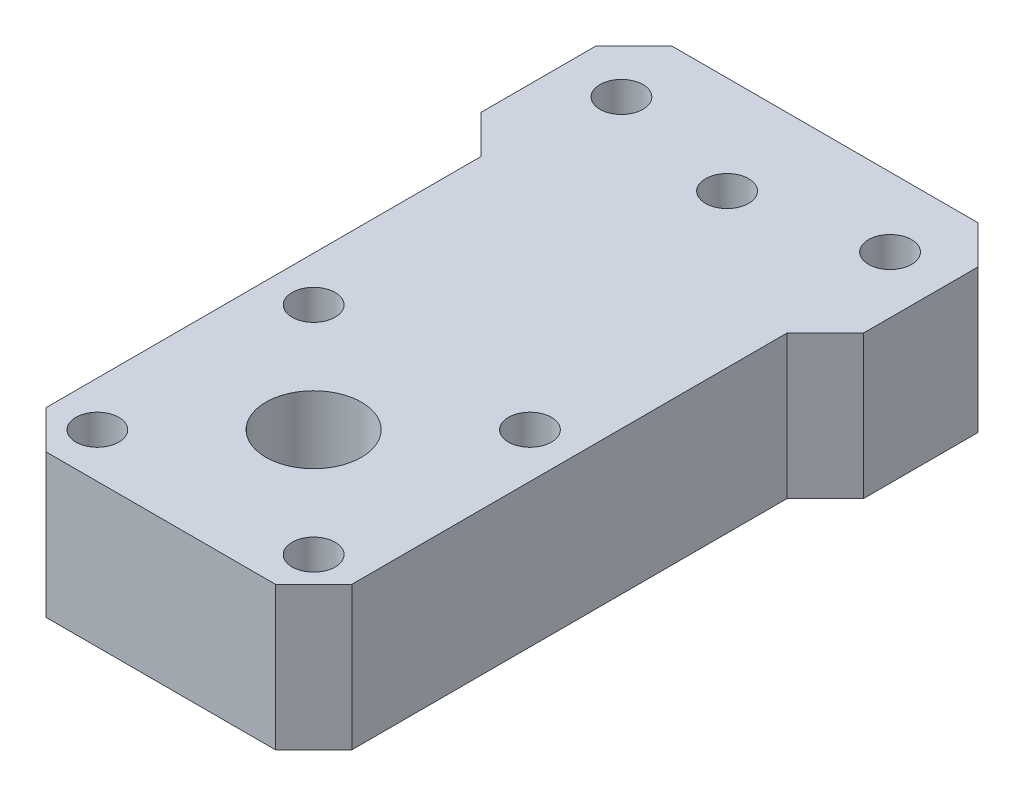
ISO-10303-21;
HEADER;
FILE_DESCRIPTION(('STEP AP214'),'2;1');
FILE_NAME('part.step','',(''),(''),'','','');
FILE_SCHEMA(('AUTOMOTIVE_DESIGN { 1 0 10303 214 1 1 1 1 }'));
ENDSEC;
DATA;
#1=APPLICATION_CONTEXT('core data for automotive mechanical design processes');
#2=APPLICATION_PROTOCOL_DEFINITION('international standard','automotive_design',2000,#1);
#3=PRODUCT_CONTEXT('',#1,'mechanical');
#4=PRODUCT('Part','Part','',(#3));
#5=PRODUCT_RELATED_PRODUCT_CATEGORY('part','',(#4));
#6=PRODUCT_DEFINITION_FORMATION('','',#4);
#7=PRODUCT_DEFINITION_CONTEXT('part definition',#1,'design');
#8=PRODUCT_DEFINITION('design','',#6,#7);
#9=PRODUCT_DEFINITION_SHAPE('','',#8);
#10=(LENGTH_UNIT() NAMED_UNIT(*) SI_UNIT(.MILLI.,.METRE.));
#11=(NAMED_UNIT(*) PLANE_ANGLE_UNIT() SI_UNIT($,.RADIAN.));
#12=(NAMED_UNIT(*) SI_UNIT($,.STERADIAN.) SOLID_ANGLE_UNIT());
#13=UNCERTAINTY_MEASURE_WITH_UNIT(LENGTH_MEASURE(1.E-05),#10,'distance_accuracy_value','');
#14=(GEOMETRIC_REPRESENTATION_CONTEXT(3) GLOBAL_UNCERTAINTY_ASSIGNED_CONTEXT((#13)) GLOBAL_UNIT_ASSIGNED_CONTEXT((#10,
#11,#12)) REPRESENTATION_CONTEXT('',''));
#15=CARTESIAN_POINT('',(0.,0.,0.));
#16=DIRECTION('',(0.,0.,1.));
#17=DIRECTION('',(1.,0.,0.));
#18=AXIS2_PLACEMENT_3D('',#15,#16,#17);
#19=CARTESIAN_POINT('',(-16.,15.,16.));
#20=DIRECTION('',(1.,0.,0.));
#21=DIRECTION('',(0.,0.,-1.));
#22=AXIS2_PLACEMENT_3D('',#19,#20,#21);
#23=PLANE('',#22);
#24=DIRECTION('',(0.,0.,1.));
#25=VECTOR('',#24,1.);
#26=CARTESIAN_POINT('',(-16.,15.,16.));
#27=LINE('',#26,#25);
#28=CARTESIAN_POINT('',(-16.,15.,-33.5));
#29=VERTEX_POINT('',#28);
#30=CARTESIAN_POINT('',(-16.,15.,12.));
#31=VERTEX_POINT('',#30);
#32=EDGE_CURVE('E186',#29,#31,#27,.T.);
#33=ORIENTED_EDGE('',*,*,#32,.F.);
#34=DIRECTION('',(0.,-1.,0.));
#35=VECTOR('',#34,1.);
#36=CARTESIAN_POINT('',(-16.,0.,-33.5));
#37=LINE('',#36,#35);
#38=CARTESIAN_POINT('',(-16.,0.,-33.5));
#39=VERTEX_POINT('',#38);
#40=EDGE_CURVE('E128',#29,#39,#37,.T.);
#41=ORIENTED_EDGE('',*,*,#40,.T.);
#42=DIRECTION('',(0.,0.,1.));
#43=VECTOR('',#42,1.);
#44=CARTESIAN_POINT('',(-16.,0.,16.));
#45=LINE('',#44,#43);
#46=CARTESIAN_POINT('',(-16.,0.,12.));
#47=VERTEX_POINT('',#46);
#48=EDGE_CURVE('E183',#39,#47,#45,.T.);
#49=ORIENTED_EDGE('',*,*,#48,.T.);
#50=DIRECTION('',(0.,1.,0.));
#51=VECTOR('',#50,1.);
#52=CARTESIAN_POINT('',(-16.,15.,12.));
#53=LINE('',#52,#51);
#54=EDGE_CURVE('E196',#47,#31,#53,.T.);
#55=ORIENTED_EDGE('',*,*,#54,.T.);
#56=EDGE_LOOP('',(#33,#41,#49,#55));
#57=FACE_BOUND('',#56,.T.);
#58=ADVANCED_FACE('F32',(#57),#23,.F.);
#59=CARTESIAN_POINT('',(16.,15.,16.));
#60=DIRECTION('',(-1.,0.,0.));
#61=DIRECTION('',(0.,0.,1.));
#62=AXIS2_PLACEMENT_3D('',#59,#60,#61);
#63=PLANE('',#62);
#64=DIRECTION('',(0.,0.,-1.));
#65=VECTOR('',#64,1.);
#66=CARTESIAN_POINT('',(16.,0.,16.));
#67=LINE('',#66,#65);
#68=CARTESIAN_POINT('',(16.,0.,12.));
#69=VERTEX_POINT('',#68);
#70=CARTESIAN_POINT('',(16.,0.,-33.5));
#71=VERTEX_POINT('',#70);
#72=EDGE_CURVE('E201',#69,#71,#67,.T.);
#73=ORIENTED_EDGE('',*,*,#72,.T.);
#74=DIRECTION('',(0.,1.,0.));
#75=VECTOR('',#74,1.);
#76=CARTESIAN_POINT('',(16.,15.,-33.5));
#77=LINE('',#76,#75);
#78=CARTESIAN_POINT('',(16.,15.,-33.5));
#79=VERTEX_POINT('',#78);
#80=EDGE_CURVE('E211',#71,#79,#77,.T.);
#81=ORIENTED_EDGE('',*,*,#80,.T.);
#82=DIRECTION('',(0.,0.,-1.));
#83=VECTOR('',#82,1.);
#84=CARTESIAN_POINT('',(16.,15.,16.));
#85=LINE('',#84,#83);
#86=CARTESIAN_POINT('',(16.,15.,12.));
#87=VERTEX_POINT('',#86);
#88=EDGE_CURVE('E191',#87,#79,#85,.T.);
#89=ORIENTED_EDGE('',*,*,#88,.F.);
#90=DIRECTION('',(0.,-1.,0.));
#91=VECTOR('',#90,1.);
#92=CARTESIAN_POINT('',(16.,15.,12.));
#93=LINE('',#92,#91);
#94=EDGE_CURVE('E208',#87,#69,#93,.T.);
#95=ORIENTED_EDGE('',*,*,#94,.T.);
#96=EDGE_LOOP('',(#73,#81,#89,#95));
#97=FACE_BOUND('',#96,.T.);
#98=ADVANCED_FACE('F252',(#97),#63,.F.);
#99=CARTESIAN_POINT('',(0.,15.,0.));
#100=DIRECTION('',(0.,-1.,0.));
#101=DIRECTION('',(0.,0.,-1.));
#102=AXIS2_PLACEMENT_3D('',#99,#100,#101);
#103=PLANE('',#102);
#104=CARTESIAN_POINT('',(-14.05,15.,-46.25));
#105=DIRECTION('',(0.,1.,0.));
#106=DIRECTION('',(0.,0.,1.));
#107=AXIS2_PLACEMENT_3D('',#104,#105,#106);
#108=CIRCLE('',#107,2.25);
#109=CARTESIAN_POINT('',(-14.05,15.,-44.));
#110=VERTEX_POINT('',#109);
#111=EDGE_CURVE('E277',#110,#110,#108,.T.);
#112=ORIENTED_EDGE('',*,*,#111,.F.);
#113=EDGE_LOOP('',(#112));
#114=FACE_BOUND('',#113,.T.);
#115=CARTESIAN_POINT('',(14.05,15.,-46.25));
#116=DIRECTION('',(0.,1.,0.));
#117=DIRECTION('',(0.,0.,1.));
#118=AXIS2_PLACEMENT_3D('',#115,#116,#117);
#119=CIRCLE('',#118,2.25);
#120=CARTESIAN_POINT('',(14.05,15.,-44.));
#121=VERTEX_POINT('',#120);
#122=EDGE_CURVE('E272',#121,#121,#119,.T.);
#123=ORIENTED_EDGE('',*,*,#122,.F.);
#124=EDGE_LOOP('',(#123));
#125=FACE_BOUND('',#124,.T.);
#126=CARTESIAN_POINT('',(0.,15.,-43.25));
#127=DIRECTION('',(0.,1.,0.));
#128=DIRECTION('',(0.,0.,1.));
#129=AXIS2_PLACEMENT_3D('',#126,#127,#128);
#130=CIRCLE('',#129,2.25);
#131=CARTESIAN_POINT('',(0.,15.,-41.));
#132=VERTEX_POINT('',#131);
#133=EDGE_CURVE('E267',#132,#132,#130,.T.);
#134=ORIENTED_EDGE('',*,*,#133,.F.);
#135=EDGE_LOOP('',(#134));
#136=FACE_BOUND('',#135,.T.);
#137=DIRECTION('',(0.,0.,-1.));
#138=VECTOR('',#137,1.);
#139=CARTESIAN_POINT('',(20.,15.,-53.5));
#140=LINE('',#139,#138);
#141=CARTESIAN_POINT('',(20.,15.,-37.5));
#142=VERTEX_POINT('',#141);
#143=CARTESIAN_POINT('',(20.,15.,-49.5));
#144=VERTEX_POINT('',#143);
#145=EDGE_CURVE('E144',#142,#144,#140,.T.);
#146=ORIENTED_EDGE('',*,*,#145,.T.);
#147=DIRECTION('',(0.707106781186546,0.,0.707106781186549));
#148=VECTOR('',#147,1.);
#149=CARTESIAN_POINT('',(16.,15.,-53.5));
#150=LINE('',#149,#148);
#151=CARTESIAN_POINT('',(16.,15.,-53.5));
#152=VERTEX_POINT('',#151);
#153=EDGE_CURVE('E232',#144,#152,#150,.F.);
#154=ORIENTED_EDGE('',*,*,#153,.T.);
#155=DIRECTION('',(-1.,0.,0.));
#156=VECTOR('',#155,1.);
#157=CARTESIAN_POINT('',(-16.,15.,-53.5));
#158=LINE('',#157,#156);
#159=CARTESIAN_POINT('',(-16.,15.,-53.5));
#160=VERTEX_POINT('',#159);
#161=EDGE_CURVE('E194',#152,#160,#158,.T.);
#162=ORIENTED_EDGE('',*,*,#161,.T.);
#163=DIRECTION('',(0.707106781186549,0.,-0.707106781186546));
#164=VECTOR('',#163,1.);
#165=CARTESIAN_POINT('',(-20.,15.,-49.5));
#166=LINE('',#165,#164);
#167=CARTESIAN_POINT('',(-20.,15.,-49.5));
#168=VERTEX_POINT('',#167);
#169=EDGE_CURVE('E139',#160,#168,#166,.F.);
#170=ORIENTED_EDGE('',*,*,#169,.T.);
#171=DIRECTION('',(0.,0.,1.));
#172=VECTOR('',#171,1.);
#173=CARTESIAN_POINT('',(-20.,15.,-53.5));
#174=LINE('',#173,#172);
#175=CARTESIAN_POINT('',(-20.,15.,-37.5));
#176=VERTEX_POINT('',#175);
#177=EDGE_CURVE('E133',#168,#176,#174,.T.);
#178=ORIENTED_EDGE('',*,*,#177,.T.);
#179=DIRECTION('',(-0.707106781186551,0.,-0.707106781186544));
#180=VECTOR('',#179,1.);
#181=CARTESIAN_POINT('',(8.75000000000009,15.,-8.75000000000018));
#182=LINE('',#181,#180);
#183=EDGE_CURVE('E122',#176,#29,#182,.F.);
#184=ORIENTED_EDGE('',*,*,#183,.T.);
#185=ORIENTED_EDGE('',*,*,#32,.T.);
#186=DIRECTION('',(-0.707106781186547,0.,-0.707106781186548));
#187=VECTOR('',#186,1.);
#188=CARTESIAN_POINT('',(-12.,15.,16.));
#189=LINE('',#188,#187);
#190=CARTESIAN_POINT('',(-12.,15.,16.));
#191=VERTEX_POINT('',#190);
#192=EDGE_CURVE('E54',#31,#191,#189,.F.);
#193=ORIENTED_EDGE('',*,*,#192,.T.);
#194=DIRECTION('',(1.,0.,0.));
#195=VECTOR('',#194,1.);
#196=CARTESIAN_POINT('',(-16.,15.,16.));
#197=LINE('',#196,#195);
#198=CARTESIAN_POINT('',(12.,15.,16.));
#199=VERTEX_POINT('',#198);
#200=EDGE_CURVE('E188',#191,#199,#197,.T.);
#201=ORIENTED_EDGE('',*,*,#200,.T.);
#202=DIRECTION('',(-0.707106781186549,0.,0.707106781186546));
#203=VECTOR('',#202,1.);
#204=CARTESIAN_POINT('',(16.,15.,12.));
#205=LINE('',#204,#203);
#206=EDGE_CURVE('E229',#199,#87,#205,.F.);
#207=ORIENTED_EDGE('',*,*,#206,.T.);
#208=ORIENTED_EDGE('',*,*,#88,.T.);
#209=DIRECTION('',(-0.707106781186551,0.,0.707106781186544));
#210=VECTOR('',#209,1.);
#211=CARTESIAN_POINT('',(-8.7500000000001,15.,-8.75000000000019));
#212=LINE('',#211,#210);
#213=EDGE_CURVE('E11',#79,#142,#212,.F.);
#214=ORIENTED_EDGE('',*,*,#213,.T.);
#215=EDGE_LOOP('',(#146,#154,#162,#170,#178,#184,#185,#193,#201,#207,#208,#214));
#216=FACE_BOUND('',#215,.T.);
#217=CARTESIAN_POINT('',(-11.3137084989848,15.,11.3137084989848));
#218=DIRECTION('',(0.,1.,0.));
#219=DIRECTION('',(0.,0.,1.));
#220=AXIS2_PLACEMENT_3D('',#217,#218,#219);
#221=CIRCLE('',#220,2.25);
#222=CARTESIAN_POINT('',(-11.3137084989848,15.,13.5637084989848));
#223=VERTEX_POINT('',#222);
#224=EDGE_CURVE('E153',#223,#223,#221,.T.);
#225=ORIENTED_EDGE('',*,*,#224,.F.);
#226=EDGE_LOOP('',(#225));
#227=FACE_BOUND('',#226,.T.);
#228=CARTESIAN_POINT('',(-11.3137084989848,15.,-11.3137084989848));
#229=DIRECTION('',(0.,1.,0.));
#230=DIRECTION('',(0.,0.,1.));
#231=AXIS2_PLACEMENT_3D('',#228,#229,#230);
#232=CIRCLE('',#231,2.25);
#233=CARTESIAN_POINT('',(-11.3137084989848,15.,-9.06370849898475));
#234=VERTEX_POINT('',#233);
#235=EDGE_CURVE('E162',#234,#234,#232,.T.);
#236=ORIENTED_EDGE('',*,*,#235,.F.);
#237=EDGE_LOOP('',(#236));
#238=FACE_BOUND('',#237,.T.);
#239=CARTESIAN_POINT('',(11.3137084989848,15.,-11.3137084989848));
#240=DIRECTION('',(0.,1.,0.));
#241=DIRECTION('',(0.,0.,1.));
#242=AXIS2_PLACEMENT_3D('',#239,#240,#241);
#243=CIRCLE('',#242,2.25);
#244=CARTESIAN_POINT('',(11.3137084989848,15.,-9.06370849898476));
#245=VERTEX_POINT('',#244);
#246=EDGE_CURVE('E168',#245,#245,#243,.T.);
#247=ORIENTED_EDGE('',*,*,#246,.F.);
#248=EDGE_LOOP('',(#247));
#249=FACE_BOUND('',#248,.T.);
#250=CARTESIAN_POINT('',(11.3137084989848,15.,11.3137084989848));
#251=DIRECTION('',(0.,1.,0.));
#252=DIRECTION('',(0.,0.,1.));
#253=AXIS2_PLACEMENT_3D('',#250,#251,#252);
#254=CIRCLE('',#253,2.25);
#255=CARTESIAN_POINT('',(11.3137084989848,15.,13.5637084989848));
#256=VERTEX_POINT('',#255);
#257=EDGE_CURVE('E174',#256,#256,#254,.T.);
#258=ORIENTED_EDGE('',*,*,#257,.F.);
#259=EDGE_LOOP('',(#258));
#260=FACE_BOUND('',#259,.T.);
#261=CARTESIAN_POINT('',(0.,15.,0.));
#262=DIRECTION('',(0.,1.,0.));
#263=DIRECTION('',(0.,0.,1.));
#264=AXIS2_PLACEMENT_3D('',#261,#262,#263);
#265=CIRCLE('',#264,5.);
#266=CARTESIAN_POINT('',(0.,15.,5.));
#267=VERTEX_POINT('',#266);
#268=EDGE_CURVE('E180',#267,#267,#265,.T.);
#269=ORIENTED_EDGE('',*,*,#268,.F.);
#270=EDGE_LOOP('',(#269));
#271=FACE_BOUND('',#270,.T.);
#272=ADVANCED_FACE('F135',(#114,#125,#136,#216,#227,#238,#249,#260,#271),#103,.F.);
#273=CARTESIAN_POINT('',(0.,0.,0.));
#274=DIRECTION('',(0.,-1.,0.));
#275=DIRECTION('',(0.,0.,-1.));
#276=AXIS2_PLACEMENT_3D('',#273,#274,#275);
#277=PLANE('',#276);
#278=CARTESIAN_POINT('',(-14.05,0.,-46.25));
#279=DIRECTION('',(0.,1.,0.));
#280=DIRECTION('',(0.,0.,1.));
#281=AXIS2_PLACEMENT_3D('',#278,#279,#280);
#282=CIRCLE('',#281,2.25);
#283=CARTESIAN_POINT('',(-14.05,0.,-44.));
#284=VERTEX_POINT('',#283);
#285=EDGE_CURVE('E280',#284,#284,#282,.T.);
#286=ORIENTED_EDGE('',*,*,#285,.T.);
#287=EDGE_LOOP('',(#286));
#288=FACE_BOUND('',#287,.T.);
#289=CARTESIAN_POINT('',(14.05,0.,-46.25));
#290=DIRECTION('',(0.,1.,0.));
#291=DIRECTION('',(0.,0.,1.));
#292=AXIS2_PLACEMENT_3D('',#289,#290,#291);
#293=CIRCLE('',#292,2.25);
#294=CARTESIAN_POINT('',(14.05,0.,-44.));
#295=VERTEX_POINT('',#294);
#296=EDGE_CURVE('E274',#295,#295,#293,.T.);
#297=ORIENTED_EDGE('',*,*,#296,.T.);
#298=EDGE_LOOP('',(#297));
#299=FACE_BOUND('',#298,.T.);
#300=CARTESIAN_POINT('',(0.,0.,-43.25));
#301=DIRECTION('',(0.,1.,0.));
#302=DIRECTION('',(0.,0.,1.));
#303=AXIS2_PLACEMENT_3D('',#300,#301,#302);
#304=CIRCLE('',#303,2.25);
#305=CARTESIAN_POINT('',(0.,0.,-41.));
#306=VERTEX_POINT('',#305);
#307=EDGE_CURVE('E264',#306,#306,#304,.T.);
#308=ORIENTED_EDGE('',*,*,#307,.T.);
#309=EDGE_LOOP('',(#308));
#310=FACE_BOUND('',#309,.T.);
#311=DIRECTION('',(-1.,0.,0.));
#312=VECTOR('',#311,1.);
#313=CARTESIAN_POINT('',(-16.,0.,-53.5));
#314=LINE('',#313,#312);
#315=CARTESIAN_POINT('',(16.,0.,-53.5));
#316=VERTEX_POINT('',#315);
#317=CARTESIAN_POINT('',(-16.,0.,-53.5));
#318=VERTEX_POINT('',#317);
#319=EDGE_CURVE('E189',#316,#318,#314,.T.);
#320=ORIENTED_EDGE('',*,*,#319,.F.);
#321=DIRECTION('',(-0.707106781186546,0.,-0.707106781186549));
#322=VECTOR('',#321,1.);
#323=CARTESIAN_POINT('',(34.75,0.,-34.7499999999999));
#324=LINE('',#323,#322);
#325=CARTESIAN_POINT('',(20.,0.,-49.5));
#326=VERTEX_POINT('',#325);
#327=EDGE_CURVE('E224',#316,#326,#324,.F.);
#328=ORIENTED_EDGE('',*,*,#327,.T.);
#329=DIRECTION('',(0.,0.,-1.));
#330=VECTOR('',#329,1.);
#331=CARTESIAN_POINT('',(20.,0.,-53.5));
#332=LINE('',#331,#330);
#333=CARTESIAN_POINT('',(20.,0.,-37.5));
#334=VERTEX_POINT('',#333);
#335=EDGE_CURVE('E247',#334,#326,#332,.T.);
#336=ORIENTED_EDGE('',*,*,#335,.F.);
#337=DIRECTION('',(0.707106781186551,0.,-0.707106781186544));
#338=VECTOR('',#337,1.);
#339=CARTESIAN_POINT('',(20.,0.,-37.5));
#340=LINE('',#339,#338);
#341=EDGE_CURVE('E40',#334,#71,#340,.F.);
#342=ORIENTED_EDGE('',*,*,#341,.T.);
#343=ORIENTED_EDGE('',*,*,#72,.F.);
#344=DIRECTION('',(0.707106781186549,0.,-0.707106781186546));
#345=VECTOR('',#344,1.);
#346=CARTESIAN_POINT('',(14.,0.,14.));
#347=LINE('',#346,#345);
#348=CARTESIAN_POINT('',(12.,0.,16.));
#349=VERTEX_POINT('',#348);
#350=EDGE_CURVE('E220',#69,#349,#347,.F.);
#351=ORIENTED_EDGE('',*,*,#350,.T.);
#352=DIRECTION('',(1.,0.,0.));
#353=VECTOR('',#352,1.);
#354=CARTESIAN_POINT('',(-16.,0.,16.));
#355=LINE('',#354,#353);
#356=CARTESIAN_POINT('',(-12.,0.,16.));
#357=VERTEX_POINT('',#356);
#358=EDGE_CURVE('E199',#357,#349,#355,.T.);
#359=ORIENTED_EDGE('',*,*,#358,.F.);
#360=DIRECTION('',(0.707106781186547,0.,0.707106781186548));
#361=VECTOR('',#360,1.);
#362=CARTESIAN_POINT('',(-14.,0.,14.));
#363=LINE('',#362,#361);
#364=EDGE_CURVE('E218',#357,#47,#363,.F.);
#365=ORIENTED_EDGE('',*,*,#364,.T.);
#366=ORIENTED_EDGE('',*,*,#48,.F.);
#367=DIRECTION('',(0.707106781186551,0.,0.707106781186544));
#368=VECTOR('',#367,1.);
#369=CARTESIAN_POINT('',(-20.,0.,-37.5));
#370=LINE('',#369,#368);
#371=CARTESIAN_POINT('',(-20.,0.,-37.5));
#372=VERTEX_POINT('',#371);
#373=EDGE_CURVE('E130',#39,#372,#370,.F.);
#374=ORIENTED_EDGE('',*,*,#373,.T.);
#375=DIRECTION('',(0.,0.,1.));
#376=VECTOR('',#375,1.);
#377=CARTESIAN_POINT('',(-20.,0.,-53.5));
#378=LINE('',#377,#376);
#379=CARTESIAN_POINT('',(-20.,0.,-49.5));
#380=VERTEX_POINT('',#379);
#381=EDGE_CURVE('E149',#380,#372,#378,.T.);
#382=ORIENTED_EDGE('',*,*,#381,.F.);
#383=DIRECTION('',(-0.707106781186549,0.,0.707106781186546));
#384=VECTOR('',#383,1.);
#385=CARTESIAN_POINT('',(-34.75,0.,-34.7500000000001));
#386=LINE('',#385,#384);
#387=EDGE_CURVE('E222',#380,#318,#386,.F.);
#388=ORIENTED_EDGE('',*,*,#387,.T.);
#389=EDGE_LOOP('',(#320,#328,#336,#342,#343,#351,#359,#365,#366,#374,#382,#388));
#390=FACE_BOUND('',#389,.T.);
#391=CARTESIAN_POINT('',(-11.3137084989848,0.,-11.3137084989848));
#392=DIRECTION('',(0.,1.,0.));
#393=DIRECTION('',(0.,0.,1.));
#394=AXIS2_PLACEMENT_3D('',#391,#392,#393);
#395=CIRCLE('',#394,2.25);
#396=CARTESIAN_POINT('',(-11.3137084989848,0.,-9.06370849898475));
#397=VERTEX_POINT('',#396);
#398=EDGE_CURVE('E160',#397,#397,#395,.T.);
#399=ORIENTED_EDGE('',*,*,#398,.T.);
#400=EDGE_LOOP('',(#399));
#401=FACE_BOUND('',#400,.T.);
#402=CARTESIAN_POINT('',(11.3137084989848,0.,11.3137084989848));
#403=DIRECTION('',(0.,1.,0.));
#404=DIRECTION('',(0.,0.,1.));
#405=AXIS2_PLACEMENT_3D('',#402,#403,#404);
#406=CIRCLE('',#405,2.25);
#407=CARTESIAN_POINT('',(11.3137084989848,0.,13.5637084989848));
#408=VERTEX_POINT('',#407);
#409=EDGE_CURVE('E171',#408,#408,#406,.T.);
#410=ORIENTED_EDGE('',*,*,#409,.T.);
#411=EDGE_LOOP('',(#410));
#412=FACE_BOUND('',#411,.T.);
#413=CARTESIAN_POINT('',(0.,0.,0.));
#414=DIRECTION('',(0.,1.,0.));
#415=DIRECTION('',(0.,0.,1.));
#416=AXIS2_PLACEMENT_3D('',#413,#414,#415);
#417=CIRCLE('',#416,5.);
#418=CARTESIAN_POINT('',(0.,0.,5.));
#419=VERTEX_POINT('',#418);
#420=EDGE_CURVE('E177',#419,#419,#417,.T.);
#421=ORIENTED_EDGE('',*,*,#420,.T.);
#422=EDGE_LOOP('',(#421));
#423=FACE_BOUND('',#422,.T.);
#424=CARTESIAN_POINT('',(11.3137084989848,0.,-11.3137084989848));
#425=DIRECTION('',(0.,1.,0.));
#426=DIRECTION('',(0.,0.,1.));
#427=AXIS2_PLACEMENT_3D('',#424,#425,#426);
#428=CIRCLE('',#427,2.25);
#429=CARTESIAN_POINT('',(11.3137084989848,0.,-9.06370849898476));
#430=VERTEX_POINT('',#429);
#431=EDGE_CURVE('E165',#430,#430,#428,.T.);
#432=ORIENTED_EDGE('',*,*,#431,.T.);
#433=EDGE_LOOP('',(#432));
#434=FACE_BOUND('',#433,.T.);
#435=CARTESIAN_POINT('',(-11.3137084989848,0.,11.3137084989848));
#436=DIRECTION('',(0.,1.,0.));
#437=DIRECTION('',(0.,0.,1.));
#438=AXIS2_PLACEMENT_3D('',#435,#436,#437);
#439=CIRCLE('',#438,2.25);
#440=CARTESIAN_POINT('',(-11.3137084989848,0.,13.5637084989848));
#441=VERTEX_POINT('',#440);
#442=EDGE_CURVE('E150',#441,#441,#439,.T.);
#443=ORIENTED_EDGE('',*,*,#442,.T.);
#444=EDGE_LOOP('',(#443));
#445=FACE_BOUND('',#444,.T.);
#446=ADVANCED_FACE('F244',(#288,#299,#310,#390,#401,#412,#423,#434,#445),#277,.T.);
#447=CARTESIAN_POINT('',(-16.,15.,16.));
#448=DIRECTION('',(0.,0.,-1.));
#449=DIRECTION('',(-1.,0.,0.));
#450=AXIS2_PLACEMENT_3D('',#447,#448,#449);
#451=PLANE('',#450);
#452=ORIENTED_EDGE('',*,*,#358,.T.);
#453=DIRECTION('',(0.,1.,0.));
#454=VECTOR('',#453,1.);
#455=CARTESIAN_POINT('',(12.,15.,16.));
#456=LINE('',#455,#454);
#457=EDGE_CURVE('E47',#349,#199,#456,.T.);
#458=ORIENTED_EDGE('',*,*,#457,.T.);
#459=ORIENTED_EDGE('',*,*,#200,.F.);
#460=DIRECTION('',(0.,-1.,0.));
#461=VECTOR('',#460,1.);
#462=CARTESIAN_POINT('',(-12.,15.,16.));
#463=LINE('',#462,#461);
#464=EDGE_CURVE('E236',#191,#357,#463,.T.);
#465=ORIENTED_EDGE('',*,*,#464,.T.);
#466=EDGE_LOOP('',(#452,#458,#459,#465));
#467=FACE_BOUND('',#466,.T.);
#468=ADVANCED_FACE('F304',(#467),#451,.F.);
#469=CARTESIAN_POINT('',(-16.,15.,-53.5));
#470=DIRECTION('',(0.,0.,1.));
#471=DIRECTION('',(1.,0.,0.));
#472=AXIS2_PLACEMENT_3D('',#469,#470,#471);
#473=PLANE('',#472);
#474=ORIENTED_EDGE('',*,*,#161,.F.);
#475=DIRECTION('',(0.,-1.,0.));
#476=VECTOR('',#475,1.);
#477=CARTESIAN_POINT('',(16.,15.,-53.5));
#478=LINE('',#477,#476);
#479=EDGE_CURVE('E215',#152,#316,#478,.T.);
#480=ORIENTED_EDGE('',*,*,#479,.T.);
#481=ORIENTED_EDGE('',*,*,#319,.T.);
#482=DIRECTION('',(0.,1.,0.));
#483=VECTOR('',#482,1.);
#484=CARTESIAN_POINT('',(-16.,15.,-53.5));
#485=LINE('',#484,#483);
#486=EDGE_CURVE('E213',#318,#160,#485,.T.);
#487=ORIENTED_EDGE('',*,*,#486,.T.);
#488=EDGE_LOOP('',(#474,#480,#481,#487));
#489=FACE_BOUND('',#488,.T.);
#490=ADVANCED_FACE('F350',(#489),#473,.F.);
#491=CARTESIAN_POINT('',(0.,15.,0.));
#492=DIRECTION('',(0.,-1.,0.));
#493=DIRECTION('',(0.,0.,-1.));
#494=AXIS2_PLACEMENT_3D('',#491,#492,#493);
#495=CYLINDRICAL_SURFACE('',#494,5.);
#496=ORIENTED_EDGE('',*,*,#268,.T.);
#497=EDGE_LOOP('',(#496));
#498=FACE_BOUND('',#497,.T.);
#499=ORIENTED_EDGE('',*,*,#420,.F.);
#500=EDGE_LOOP('',(#499));
#501=FACE_BOUND('',#500,.T.);
#502=ADVANCED_FACE('F353',(#498,#501),#495,.F.);
#503=CARTESIAN_POINT('',(11.3137084989848,15.,11.3137084989848));
#504=DIRECTION('',(0.,-1.,0.));
#505=DIRECTION('',(0.,0.,-1.));
#506=AXIS2_PLACEMENT_3D('',#503,#504,#505);
#507=CYLINDRICAL_SURFACE('',#506,2.25);
#508=ORIENTED_EDGE('',*,*,#257,.T.);
#509=EDGE_LOOP('',(#508));
#510=FACE_BOUND('',#509,.T.);
#511=ORIENTED_EDGE('',*,*,#409,.F.);
#512=EDGE_LOOP('',(#511));
#513=FACE_BOUND('',#512,.T.);
#514=ADVANCED_FACE('F359',(#510,#513),#507,.F.);
#515=CARTESIAN_POINT('',(11.3137084989848,15.,-11.3137084989848));
#516=DIRECTION('',(0.,-1.,0.));
#517=DIRECTION('',(0.,0.,-1.));
#518=AXIS2_PLACEMENT_3D('',#515,#516,#517);
#519=CYLINDRICAL_SURFACE('',#518,2.25);
#520=ORIENTED_EDGE('',*,*,#246,.T.);
#521=EDGE_LOOP('',(#520));
#522=FACE_BOUND('',#521,.T.);
#523=ORIENTED_EDGE('',*,*,#431,.F.);
#524=EDGE_LOOP('',(#523));
#525=FACE_BOUND('',#524,.T.);
#526=ADVANCED_FACE('F365',(#522,#525),#519,.F.);
#527=CARTESIAN_POINT('',(-11.3137084989848,15.,-11.3137084989848));
#528=DIRECTION('',(0.,-1.,0.));
#529=DIRECTION('',(0.,0.,-1.));
#530=AXIS2_PLACEMENT_3D('',#527,#528,#529);
#531=CYLINDRICAL_SURFACE('',#530,2.25);
#532=ORIENTED_EDGE('',*,*,#235,.T.);
#533=EDGE_LOOP('',(#532));
#534=FACE_BOUND('',#533,.T.);
#535=ORIENTED_EDGE('',*,*,#398,.F.);
#536=EDGE_LOOP('',(#535));
#537=FACE_BOUND('',#536,.T.);
#538=ADVANCED_FACE('F369',(#534,#537),#531,.F.);
#539=CARTESIAN_POINT('',(-11.3137084989848,15.,11.3137084989848));
#540=DIRECTION('',(0.,-1.,0.));
#541=DIRECTION('',(0.,0.,-1.));
#542=AXIS2_PLACEMENT_3D('',#539,#540,#541);
#543=CYLINDRICAL_SURFACE('',#542,2.25);
#544=ORIENTED_EDGE('',*,*,#224,.T.);
#545=EDGE_LOOP('',(#544));
#546=FACE_BOUND('',#545,.T.);
#547=ORIENTED_EDGE('',*,*,#442,.F.);
#548=EDGE_LOOP('',(#547));
#549=FACE_BOUND('',#548,.T.);
#550=ADVANCED_FACE('F373',(#546,#549),#543,.F.);
#551=CARTESIAN_POINT('',(20.,15.,-53.5));
#552=DIRECTION('',(-1.,0.,0.));
#553=DIRECTION('',(0.,0.,1.));
#554=AXIS2_PLACEMENT_3D('',#551,#552,#553);
#555=PLANE('',#554);
#556=ORIENTED_EDGE('',*,*,#335,.T.);
#557=DIRECTION('',(0.,1.,0.));
#558=VECTOR('',#557,1.);
#559=CARTESIAN_POINT('',(20.,15.,-49.5));
#560=LINE('',#559,#558);
#561=EDGE_CURVE('E226',#326,#144,#560,.T.);
#562=ORIENTED_EDGE('',*,*,#561,.T.);
#563=ORIENTED_EDGE('',*,*,#145,.F.);
#564=DIRECTION('',(0.,-1.,0.));
#565=VECTOR('',#564,1.);
#566=CARTESIAN_POINT('',(20.,15.,-37.5));
#567=LINE('',#566,#565);
#568=EDGE_CURVE('E143',#142,#334,#567,.T.);
#569=ORIENTED_EDGE('',*,*,#568,.T.);
#570=EDGE_LOOP('',(#556,#562,#563,#569));
#571=FACE_BOUND('',#570,.T.);
#572=ADVANCED_FACE('F260',(#571),#555,.F.);
#573=CARTESIAN_POINT('',(-20.,15.,-53.5));
#574=DIRECTION('',(1.,0.,0.));
#575=DIRECTION('',(0.,0.,-1.));
#576=AXIS2_PLACEMENT_3D('',#573,#574,#575);
#577=PLANE('',#576);
#578=ORIENTED_EDGE('',*,*,#177,.F.);
#579=DIRECTION('',(0.,-1.,0.));
#580=VECTOR('',#579,1.);
#581=CARTESIAN_POINT('',(-20.,15.,-49.5));
#582=LINE('',#581,#580);
#583=EDGE_CURVE('E234',#168,#380,#582,.T.);
#584=ORIENTED_EDGE('',*,*,#583,.T.);
#585=ORIENTED_EDGE('',*,*,#381,.T.);
#586=DIRECTION('',(0.,-1.,0.));
#587=VECTOR('',#586,1.);
#588=CARTESIAN_POINT('',(-20.,15.,-37.5));
#589=LINE('',#588,#587);
#590=EDGE_CURVE('E127',#176,#372,#589,.T.);
#591=ORIENTED_EDGE('',*,*,#590,.F.);
#592=EDGE_LOOP('',(#578,#584,#585,#591));
#593=FACE_BOUND('',#592,.T.);
#594=ADVANCED_FACE('F147',(#593),#577,.F.);
#595=CARTESIAN_POINT('',(0.,15.,-43.25));
#596=DIRECTION('',(0.,-1.,0.));
#597=DIRECTION('',(0.,0.,-1.));
#598=AXIS2_PLACEMENT_3D('',#595,#596,#597);
#599=CYLINDRICAL_SURFACE('',#598,2.25);
#600=ORIENTED_EDGE('',*,*,#133,.T.);
#601=EDGE_LOOP('',(#600));
#602=FACE_BOUND('',#601,.T.);
#603=ORIENTED_EDGE('',*,*,#307,.F.);
#604=EDGE_LOOP('',(#603));
#605=FACE_BOUND('',#604,.T.);
#606=ADVANCED_FACE('F298',(#602,#605),#599,.F.);
#607=CARTESIAN_POINT('',(14.05,15.,-46.25));
#608=DIRECTION('',(0.,-1.,0.));
#609=DIRECTION('',(0.,0.,-1.));
#610=AXIS2_PLACEMENT_3D('',#607,#608,#609);
#611=CYLINDRICAL_SURFACE('',#610,2.25);
#612=ORIENTED_EDGE('',*,*,#122,.T.);
#613=EDGE_LOOP('',(#612));
#614=FACE_BOUND('',#613,.T.);
#615=ORIENTED_EDGE('',*,*,#296,.F.);
#616=EDGE_LOOP('',(#615));
#617=FACE_BOUND('',#616,.T.);
#618=ADVANCED_FACE('F295',(#614,#617),#611,.F.);
#619=CARTESIAN_POINT('',(-14.05,15.,-46.25));
#620=DIRECTION('',(0.,-1.,0.));
#621=DIRECTION('',(0.,0.,-1.));
#622=AXIS2_PLACEMENT_3D('',#619,#620,#621);
#623=CYLINDRICAL_SURFACE('',#622,2.25);
#624=ORIENTED_EDGE('',*,*,#111,.T.);
#625=EDGE_LOOP('',(#624));
#626=FACE_BOUND('',#625,.T.);
#627=ORIENTED_EDGE('',*,*,#285,.F.);
#628=EDGE_LOOP('',(#627));
#629=FACE_BOUND('',#628,.T.);
#630=ADVANCED_FACE('F286',(#626,#629),#623,.F.);
#631=CARTESIAN_POINT('',(-20.,15.,-37.5));
#632=DIRECTION('',(-0.707106781186544,0.,0.707106781186551));
#633=DIRECTION('',(0.,-1.,0.));
#634=AXIS2_PLACEMENT_3D('',#631,#632,#633);
#635=PLANE('',#634);
#636=ORIENTED_EDGE('',*,*,#373,.F.);
#637=ORIENTED_EDGE('',*,*,#40,.F.);
#638=ORIENTED_EDGE('',*,*,#183,.F.);
#639=ORIENTED_EDGE('',*,*,#590,.T.);
#640=EDGE_LOOP('',(#636,#637,#638,#639));
#641=FACE_BOUND('',#640,.T.);
#642=ADVANCED_FACE('F125',(#641),#635,.T.);
#643=CARTESIAN_POINT('',(20.,15.,-37.5));
#644=DIRECTION('',(0.707106781186544,0.,0.707106781186551));
#645=DIRECTION('',(0.,1.,0.));
#646=AXIS2_PLACEMENT_3D('',#643,#644,#645);
#647=PLANE('',#646);
#648=ORIENTED_EDGE('',*,*,#213,.F.);
#649=ORIENTED_EDGE('',*,*,#80,.F.);
#650=ORIENTED_EDGE('',*,*,#341,.F.);
#651=ORIENTED_EDGE('',*,*,#568,.F.);
#652=EDGE_LOOP('',(#648,#649,#650,#651));
#653=FACE_BOUND('',#652,.T.);
#654=ADVANCED_FACE('F256',(#653),#647,.T.);
#655=CARTESIAN_POINT('',(16.,15.,-53.5));
#656=DIRECTION('',(-0.707106781186549,0.,0.707106781186546));
#657=DIRECTION('',(0.,-1.,0.));
#658=AXIS2_PLACEMENT_3D('',#655,#656,#657);
#659=PLANE('',#658);
#660=ORIENTED_EDGE('',*,*,#153,.F.);
#661=ORIENTED_EDGE('',*,*,#561,.F.);
#662=ORIENTED_EDGE('',*,*,#327,.F.);
#663=ORIENTED_EDGE('',*,*,#479,.F.);
#664=EDGE_LOOP('',(#660,#661,#662,#663));
#665=FACE_BOUND('',#664,.T.);
#666=ADVANCED_FACE('F328',(#665),#659,.F.);
#667=CARTESIAN_POINT('',(-20.,15.,-49.5));
#668=DIRECTION('',(0.707106781186546,0.,0.707106781186549));
#669=DIRECTION('',(0.,-1.,0.));
#670=AXIS2_PLACEMENT_3D('',#667,#668,#669);
#671=PLANE('',#670);
#672=ORIENTED_EDGE('',*,*,#169,.F.);
#673=ORIENTED_EDGE('',*,*,#486,.F.);
#674=ORIENTED_EDGE('',*,*,#387,.F.);
#675=ORIENTED_EDGE('',*,*,#583,.F.);
#676=EDGE_LOOP('',(#672,#673,#674,#675));
#677=FACE_BOUND('',#676,.T.);
#678=ADVANCED_FACE('F331',(#677),#671,.F.);
#679=CARTESIAN_POINT('',(16.,15.,12.));
#680=DIRECTION('',(-0.707106781186546,0.,-0.707106781186549));
#681=DIRECTION('',(0.,-1.,0.));
#682=AXIS2_PLACEMENT_3D('',#679,#680,#681);
#683=PLANE('',#682);
#684=ORIENTED_EDGE('',*,*,#206,.F.);
#685=ORIENTED_EDGE('',*,*,#457,.F.);
#686=ORIENTED_EDGE('',*,*,#350,.F.);
#687=ORIENTED_EDGE('',*,*,#94,.F.);
#688=EDGE_LOOP('',(#684,#685,#686,#687));
#689=FACE_BOUND('',#688,.T.);
#690=ADVANCED_FACE('F334',(#689),#683,.F.);
#691=CARTESIAN_POINT('',(-12.,15.,16.));
#692=DIRECTION('',(0.707106781186548,0.,-0.707106781186547));
#693=DIRECTION('',(0.,-1.,0.));
#694=AXIS2_PLACEMENT_3D('',#691,#692,#693);
#695=PLANE('',#694);
#696=ORIENTED_EDGE('',*,*,#192,.F.);
#697=ORIENTED_EDGE('',*,*,#54,.F.);
#698=ORIENTED_EDGE('',*,*,#364,.F.);
#699=ORIENTED_EDGE('',*,*,#464,.F.);
#700=EDGE_LOOP('',(#696,#697,#698,#699));
#701=FACE_BOUND('',#700,.T.);
#702=ADVANCED_FACE('F34',(#701),#695,.F.);
#703=CLOSED_SHELL('',(#58,#98,#272,#446,#468,#490,#502,#514,#526,#538,#550,#572,#594,#606,#618,
#630,#642,#654,#666,#678,#690,#702));
#704=MANIFOLD_SOLID_BREP('B2',#703);
#705=ADVANCED_BREP_SHAPE_REPRESENTATION('',(#18,#704),#14);
#706=SHAPE_DEFINITION_REPRESENTATION(#9,#705);
ENDSEC;
END-ISO-10303-21;
